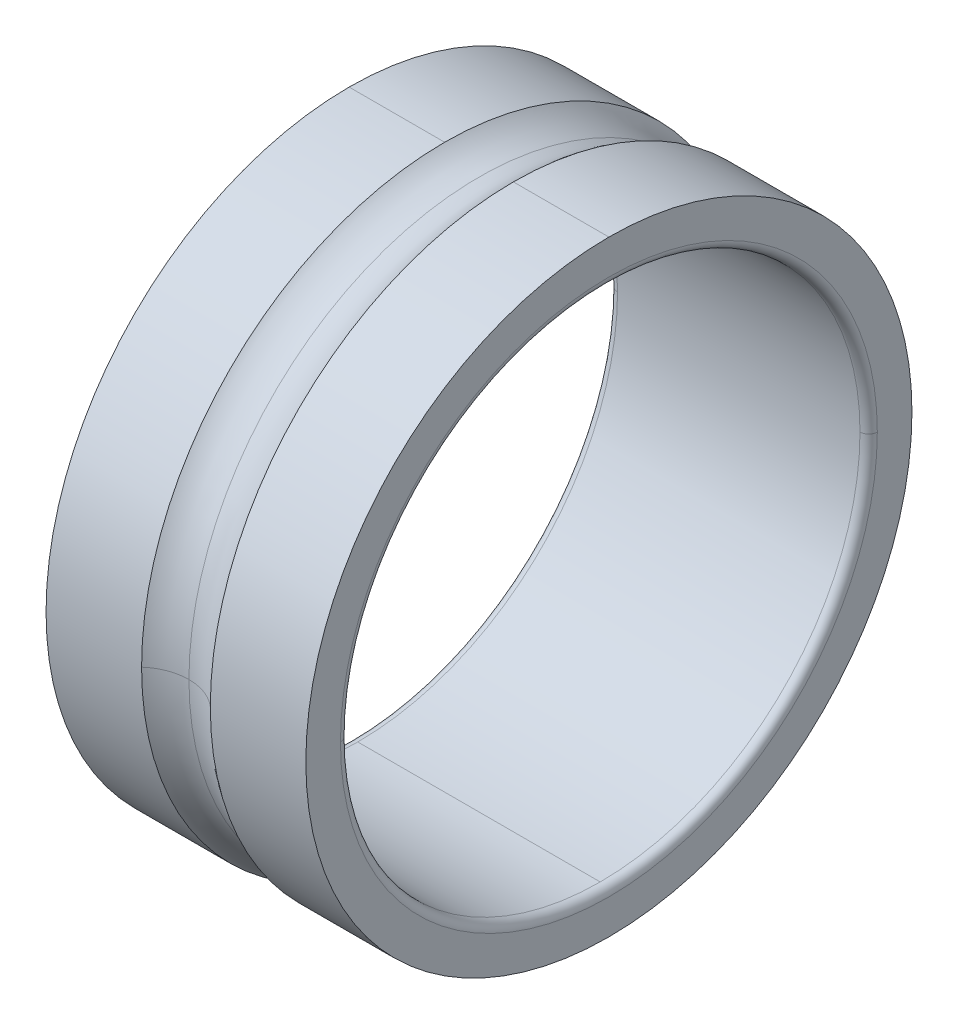
ISO-10303-21;
HEADER;
FILE_DESCRIPTION(('STEP AP214'),'2;1');
FILE_NAME('part.step','',(''),(''),'','','');
FILE_SCHEMA(('AUTOMOTIVE_DESIGN { 1 0 10303 214 1 1 1 1 }'));
ENDSEC;
DATA;
#1=APPLICATION_CONTEXT('core data for automotive mechanical design processes');
#2=APPLICATION_PROTOCOL_DEFINITION('international standard','automotive_design',2000,#1);
#3=PRODUCT_CONTEXT('',#1,'mechanical');
#4=PRODUCT('Part','Part','',(#3));
#5=PRODUCT_RELATED_PRODUCT_CATEGORY('part','',(#4));
#6=PRODUCT_DEFINITION_FORMATION('','',#4);
#7=PRODUCT_DEFINITION_CONTEXT('part definition',#1,'design');
#8=PRODUCT_DEFINITION('design','',#6,#7);
#9=PRODUCT_DEFINITION_SHAPE('','',#8);
#10=(LENGTH_UNIT() NAMED_UNIT(*) SI_UNIT(.MILLI.,.METRE.));
#11=(NAMED_UNIT(*) PLANE_ANGLE_UNIT() SI_UNIT($,.RADIAN.));
#12=(NAMED_UNIT(*) SI_UNIT($,.STERADIAN.) SOLID_ANGLE_UNIT());
#13=UNCERTAINTY_MEASURE_WITH_UNIT(LENGTH_MEASURE(1.E-05),#10,'distance_accuracy_value','');
#14=(GEOMETRIC_REPRESENTATION_CONTEXT(3) GLOBAL_UNCERTAINTY_ASSIGNED_CONTEXT((#13)) GLOBAL_UNIT_ASSIGNED_CONTEXT((#10,
#11,#12)) REPRESENTATION_CONTEXT('',''));
#15=CARTESIAN_POINT('',(0.,0.,0.));
#16=DIRECTION('',(0.,0.,1.));
#17=DIRECTION('',(1.,0.,0.));
#18=AXIS2_PLACEMENT_3D('',#15,#16,#17);
#19=CARTESIAN_POINT('',(2.44843134832985,0.,0.));
#20=DIRECTION('',(1.,0.,0.));
#21=DIRECTION('',(0.,1.,0.));
#22=AXIS2_PLACEMENT_3D('',#19,#20,#21);
#23=CYLINDRICAL_SURFACE('',#22,3.5);
#24=DIRECTION('',(1.,0.,0.));
#25=VECTOR('',#24,1.);
#26=CARTESIAN_POINT('',(2.44843134832985,3.5,0.));
#27=LINE('',#26,#25);
#28=CARTESIAN_POINT('',(1.89686269665969,3.5,0.));
#29=VERTEX_POINT('',#28);
#30=CARTESIAN_POINT('',(3.,3.5,0.));
#31=VERTEX_POINT('',#30);
#32=EDGE_CURVE('E153',#29,#31,#27,.T.);
#33=ORIENTED_EDGE('',*,*,#32,.T.);
#34=CARTESIAN_POINT('',(3.,0.,0.));
#35=DIRECTION('',(1.,0.,0.));
#36=DIRECTION('',(0.,1.,0.));
#37=AXIS2_PLACEMENT_3D('',#34,#35,#36);
#38=CIRCLE('',#37,3.5);
#39=CARTESIAN_POINT('',(3.,-3.5,0.));
#40=VERTEX_POINT('',#39);
#41=EDGE_CURVE('E175',#40,#31,#38,.T.);
#42=ORIENTED_EDGE('',*,*,#41,.F.);
#43=DIRECTION('',(-1.,0.,0.));
#44=VECTOR('',#43,1.);
#45=CARTESIAN_POINT('',(2.44843134832985,-3.5,0.));
#46=LINE('',#45,#44);
#47=CARTESIAN_POINT('',(1.89686269665969,-3.5,0.));
#48=VERTEX_POINT('',#47);
#49=EDGE_CURVE('E159',#40,#48,#46,.T.);
#50=ORIENTED_EDGE('',*,*,#49,.T.);
#51=CARTESIAN_POINT('',(1.89686269665969,0.,0.));
#52=DIRECTION('',(1.,0.,0.));
#53=DIRECTION('',(0.,1.,0.));
#54=AXIS2_PLACEMENT_3D('',#51,#52,#53);
#55=CIRCLE('',#54,3.5);
#56=CARTESIAN_POINT('',(1.89686269665969,0.,-3.5));
#57=VERTEX_POINT('',#56);
#58=EDGE_CURVE('E144',#48,#57,#55,.T.);
#59=ORIENTED_EDGE('',*,*,#58,.T.);
#60=CARTESIAN_POINT('',(1.89686269665969,0.,0.));
#61=DIRECTION('',(1.,0.,0.));
#62=DIRECTION('',(0.,1.,0.));
#63=AXIS2_PLACEMENT_3D('',#60,#61,#62);
#64=CIRCLE('',#63,3.5);
#65=EDGE_CURVE('E150',#57,#29,#64,.T.);
#66=ORIENTED_EDGE('',*,*,#65,.T.);
#67=EDGE_LOOP('',(#33,#42,#50,#59,#66));
#68=FACE_BOUND('',#67,.T.);
#69=ADVANCED_FACE('F16',(#68),#23,.T.);
#70=CARTESIAN_POINT('',(1.5,0.,0.));
#71=DIRECTION('',(1.,0.,0.));
#72=DIRECTION('',(0.,0.,-1.));
#73=AXIS2_PLACEMENT_3D('',#70,#71,#72);
#74=TOROIDAL_SURFACE('',#73,3.95,0.6);
#75=CARTESIAN_POINT('',(1.5,0.,0.));
#76=DIRECTION('',(-1.,0.,0.));
#77=DIRECTION('',(0.,0.,1.));
#78=AXIS2_PLACEMENT_3D('',#75,#76,#77);
#79=CIRCLE('',#78,3.35);
#80=CARTESIAN_POINT('',(1.5,0.,3.35));
#81=VERTEX_POINT('',#80);
#82=CARTESIAN_POINT('',(1.5,0.,-3.35));
#83=VERTEX_POINT('',#82);
#84=EDGE_CURVE('E137',#81,#83,#79,.T.);
#85=ORIENTED_EDGE('',*,*,#84,.T.);
#86=CARTESIAN_POINT('',(1.5,0.,-3.95));
#87=DIRECTION('',(0.,-1.,0.));
#88=DIRECTION('',(0.,0.,-1.));
#89=AXIS2_PLACEMENT_3D('',#86,#87,#88);
#90=CIRCLE('',#89,0.6);
#91=CARTESIAN_POINT('',(1.10313730334031,0.,-3.5));
#92=VERTEX_POINT('',#91);
#93=EDGE_CURVE('E126',#83,#92,#90,.T.);
#94=ORIENTED_EDGE('',*,*,#93,.T.);
#95=CARTESIAN_POINT('',(1.10313730334031,0.,0.));
#96=DIRECTION('',(1.,0.,0.));
#97=DIRECTION('',(0.,1.,0.));
#98=AXIS2_PLACEMENT_3D('',#95,#96,#97);
#99=CIRCLE('',#98,3.5);
#100=CARTESIAN_POINT('',(1.10313730334031,3.5,0.));
#101=VERTEX_POINT('',#100);
#102=EDGE_CURVE('E11',#92,#101,#99,.T.);
#103=ORIENTED_EDGE('',*,*,#102,.T.);
#104=CARTESIAN_POINT('',(1.10313730334031,0.,0.));
#105=DIRECTION('',(1.,0.,0.));
#106=DIRECTION('',(0.,1.,0.));
#107=AXIS2_PLACEMENT_3D('',#104,#105,#106);
#108=CIRCLE('',#107,3.5);
#109=CARTESIAN_POINT('',(1.10313730334031,0.,3.5));
#110=VERTEX_POINT('',#109);
#111=EDGE_CURVE('E125',#101,#110,#108,.T.);
#112=ORIENTED_EDGE('',*,*,#111,.T.);
#113=CARTESIAN_POINT('',(1.5,0.,3.95));
#114=DIRECTION('',(0.,-1.,0.));
#115=DIRECTION('',(0.,0.,1.));
#116=AXIS2_PLACEMENT_3D('',#113,#114,#115);
#117=CIRCLE('',#116,0.6);
#118=EDGE_CURVE('E168',#110,#81,#117,.T.);
#119=ORIENTED_EDGE('',*,*,#118,.T.);
#120=EDGE_LOOP('',(#85,#94,#103,#112,#119));
#121=FACE_BOUND('',#120,.T.);
#122=ADVANCED_FACE('F259',(#121),#74,.F.);
#123=CARTESIAN_POINT('',(0.551568651670155,0.,0.));
#124=DIRECTION('',(1.,0.,0.));
#125=DIRECTION('',(0.,1.,0.));
#126=AXIS2_PLACEMENT_3D('',#123,#124,#125);
#127=CYLINDRICAL_SURFACE('',#126,3.5);
#128=DIRECTION('',(1.,0.,0.));
#129=VECTOR('',#128,1.);
#130=CARTESIAN_POINT('',(0.551568651670155,3.5,0.));
#131=LINE('',#130,#129);
#132=CARTESIAN_POINT('',(0.,3.5,0.));
#133=VERTEX_POINT('',#132);
#134=EDGE_CURVE('E112',#133,#101,#131,.T.);
#135=ORIENTED_EDGE('',*,*,#134,.T.);
#136=ORIENTED_EDGE('',*,*,#102,.F.);
#137=CARTESIAN_POINT('',(1.10313730334031,0.,0.));
#138=DIRECTION('',(1.,0.,0.));
#139=DIRECTION('',(0.,1.,0.));
#140=AXIS2_PLACEMENT_3D('',#137,#138,#139);
#141=CIRCLE('',#140,3.5);
#142=CARTESIAN_POINT('',(1.10313730334031,-3.5,0.));
#143=VERTEX_POINT('',#142);
#144=EDGE_CURVE('E129',#143,#92,#141,.T.);
#145=ORIENTED_EDGE('',*,*,#144,.F.);
#146=DIRECTION('',(-1.,0.,0.));
#147=VECTOR('',#146,1.);
#148=CARTESIAN_POINT('',(0.551568651670155,-3.5,0.));
#149=LINE('',#148,#147);
#150=CARTESIAN_POINT('',(0.,-3.5,0.));
#151=VERTEX_POINT('',#150);
#152=EDGE_CURVE('E114',#143,#151,#149,.T.);
#153=ORIENTED_EDGE('',*,*,#152,.T.);
#154=CARTESIAN_POINT('',(0.,0.,0.));
#155=DIRECTION('',(1.,0.,0.));
#156=DIRECTION('',(0.,1.,0.));
#157=AXIS2_PLACEMENT_3D('',#154,#155,#156);
#158=CIRCLE('',#157,3.5);
#159=EDGE_CURVE('E23',#151,#133,#158,.T.);
#160=ORIENTED_EDGE('',*,*,#159,.T.);
#161=EDGE_LOOP('',(#135,#136,#145,#153,#160));
#162=FACE_BOUND('',#161,.T.);
#163=ADVANCED_FACE('F110',(#162),#127,.T.);
#164=CARTESIAN_POINT('',(0.,3.3,0.));
#165=DIRECTION('',(-1.,0.,0.));
#166=DIRECTION('',(0.,0.,1.));
#167=AXIS2_PLACEMENT_3D('',#164,#165,#166);
#168=PLANE('',#167);
#169=CARTESIAN_POINT('',(0.,0.,0.));
#170=DIRECTION('',(1.,0.,0.));
#171=DIRECTION('',(0.,1.,0.));
#172=AXIS2_PLACEMENT_3D('',#169,#170,#171);
#173=CIRCLE('',#172,3.1);
#174=CARTESIAN_POINT('',(0.,0.,3.1));
#175=VERTEX_POINT('',#174);
#176=CARTESIAN_POINT('',(0.,0.,-3.1));
#177=VERTEX_POINT('',#176);
#178=EDGE_CURVE('E117',#175,#177,#173,.T.);
#179=ORIENTED_EDGE('',*,*,#178,.T.);
#180=CARTESIAN_POINT('',(0.,0.,0.));
#181=DIRECTION('',(1.,0.,0.));
#182=DIRECTION('',(0.,1.,0.));
#183=AXIS2_PLACEMENT_3D('',#180,#181,#182);
#184=CIRCLE('',#183,3.1);
#185=EDGE_CURVE('E193',#177,#175,#184,.T.);
#186=ORIENTED_EDGE('',*,*,#185,.T.);
#187=EDGE_LOOP('',(#179,#186));
#188=FACE_BOUND('',#187,.T.);
#189=CARTESIAN_POINT('',(0.,0.,0.));
#190=DIRECTION('',(1.,0.,0.));
#191=DIRECTION('',(0.,1.,0.));
#192=AXIS2_PLACEMENT_3D('',#189,#190,#191);
#193=CIRCLE('',#192,3.5);
#194=EDGE_CURVE('E118',#133,#151,#193,.T.);
#195=ORIENTED_EDGE('',*,*,#194,.F.);
#196=ORIENTED_EDGE('',*,*,#159,.F.);
#197=EDGE_LOOP('',(#195,#196));
#198=FACE_BOUND('',#197,.T.);
#199=ADVANCED_FACE('F119',(#188,#198),#168,.T.);
#200=CARTESIAN_POINT('',(0.1,0.,0.));
#201=DIRECTION('',(1.,0.,0.));
#202=DIRECTION('',(0.,0.,-1.));
#203=AXIS2_PLACEMENT_3D('',#200,#201,#202);
#204=TOROIDAL_SURFACE('',#203,3.1,0.1);
#205=CARTESIAN_POINT('',(0.1,0.,-3.1));
#206=DIRECTION('',(0.,-1.,0.));
#207=DIRECTION('',(0.,0.,-1.));
#208=AXIS2_PLACEMENT_3D('',#205,#206,#207);
#209=CIRCLE('',#208,0.1);
#210=CARTESIAN_POINT('',(0.1,0.,-3.));
#211=VERTEX_POINT('',#210);
#212=EDGE_CURVE('E181',#211,#177,#209,.T.);
#213=ORIENTED_EDGE('',*,*,#212,.T.);
#214=ORIENTED_EDGE('',*,*,#178,.F.);
#215=CARTESIAN_POINT('',(0.1,0.,3.1));
#216=DIRECTION('',(0.,-1.,0.));
#217=DIRECTION('',(0.,0.,1.));
#218=AXIS2_PLACEMENT_3D('',#215,#216,#217);
#219=CIRCLE('',#218,0.1);
#220=CARTESIAN_POINT('',(0.1,0.,3.));
#221=VERTEX_POINT('',#220);
#222=EDGE_CURVE('E190',#175,#221,#219,.T.);
#223=ORIENTED_EDGE('',*,*,#222,.T.);
#224=CARTESIAN_POINT('',(0.1,0.,0.));
#225=DIRECTION('',(1.,0.,0.));
#226=DIRECTION('',(0.,1.,0.));
#227=AXIS2_PLACEMENT_3D('',#224,#225,#226);
#228=CIRCLE('',#227,3.);
#229=CARTESIAN_POINT('',(0.1,-3.,0.));
#230=VERTEX_POINT('',#229);
#231=EDGE_CURVE('E214',#221,#230,#228,.T.);
#232=ORIENTED_EDGE('',*,*,#231,.T.);
#233=CARTESIAN_POINT('',(0.1,0.,0.));
#234=DIRECTION('',(1.,0.,0.));
#235=DIRECTION('',(0.,1.,0.));
#236=AXIS2_PLACEMENT_3D('',#233,#234,#235);
#237=CIRCLE('',#236,3.);
#238=EDGE_CURVE('E136',#230,#211,#237,.T.);
#239=ORIENTED_EDGE('',*,*,#238,.T.);
#240=EDGE_LOOP('',(#213,#214,#223,#232,#239));
#241=FACE_BOUND('',#240,.T.);
#242=ADVANCED_FACE('F223',(#241),#204,.T.);
#243=CARTESIAN_POINT('',(1.5,0.,0.));
#244=DIRECTION('',(1.,0.,0.));
#245=DIRECTION('',(0.,1.,0.));
#246=AXIS2_PLACEMENT_3D('',#243,#244,#245);
#247=CYLINDRICAL_SURFACE('',#246,3.);
#248=DIRECTION('',(1.,0.,0.));
#249=VECTOR('',#248,1.);
#250=CARTESIAN_POINT('',(1.5,3.,0.));
#251=LINE('',#250,#249);
#252=CARTESIAN_POINT('',(0.1,3.,0.));
#253=VERTEX_POINT('',#252);
#254=CARTESIAN_POINT('',(2.9,3.,0.));
#255=VERTEX_POINT('',#254);
#256=EDGE_CURVE('E196',#253,#255,#251,.T.);
#257=ORIENTED_EDGE('',*,*,#256,.T.);
#258=CARTESIAN_POINT('',(2.9,0.,0.));
#259=DIRECTION('',(1.,0.,0.));
#260=DIRECTION('',(0.,1.,0.));
#261=AXIS2_PLACEMENT_3D('',#258,#259,#260);
#262=CIRCLE('',#261,3.);
#263=CARTESIAN_POINT('',(2.9,0.,3.));
#264=VERTEX_POINT('',#263);
#265=EDGE_CURVE('E173',#255,#264,#262,.T.);
#266=ORIENTED_EDGE('',*,*,#265,.T.);
#267=CARTESIAN_POINT('',(2.9,0.,0.));
#268=DIRECTION('',(1.,0.,0.));
#269=DIRECTION('',(0.,1.,0.));
#270=AXIS2_PLACEMENT_3D('',#267,#268,#269);
#271=CIRCLE('',#270,3.);
#272=CARTESIAN_POINT('',(2.9,-3.,0.));
#273=VERTEX_POINT('',#272);
#274=EDGE_CURVE('E30',#264,#273,#271,.T.);
#275=ORIENTED_EDGE('',*,*,#274,.T.);
#276=DIRECTION('',(-1.,0.,0.));
#277=VECTOR('',#276,1.);
#278=CARTESIAN_POINT('',(1.5,-3.,0.));
#279=LINE('',#278,#277);
#280=EDGE_CURVE('E132',#273,#230,#279,.T.);
#281=ORIENTED_EDGE('',*,*,#280,.T.);
#282=ORIENTED_EDGE('',*,*,#231,.F.);
#283=CARTESIAN_POINT('',(0.1,0.,0.));
#284=DIRECTION('',(1.,0.,0.));
#285=DIRECTION('',(0.,1.,0.));
#286=AXIS2_PLACEMENT_3D('',#283,#284,#285);
#287=CIRCLE('',#286,3.);
#288=EDGE_CURVE('E187',#253,#221,#287,.T.);
#289=ORIENTED_EDGE('',*,*,#288,.F.);
#290=EDGE_LOOP('',(#257,#266,#275,#281,#282,#289));
#291=FACE_BOUND('',#290,.T.);
#292=ADVANCED_FACE('F231',(#291),#247,.F.);
#293=CARTESIAN_POINT('',(2.9,0.,0.));
#294=DIRECTION('',(1.,0.,0.));
#295=DIRECTION('',(0.,0.,-1.));
#296=AXIS2_PLACEMENT_3D('',#293,#294,#295);
#297=TOROIDAL_SURFACE('',#296,3.1,0.1);
#298=CARTESIAN_POINT('',(2.9,0.,-3.1));
#299=DIRECTION('',(0.,-1.,0.));
#300=DIRECTION('',(0.,0.,-1.));
#301=AXIS2_PLACEMENT_3D('',#298,#299,#300);
#302=CIRCLE('',#301,0.1);
#303=CARTESIAN_POINT('',(3.,0.,-3.1));
#304=VERTEX_POINT('',#303);
#305=CARTESIAN_POINT('',(2.9,0.,-3.));
#306=VERTEX_POINT('',#305);
#307=EDGE_CURVE('E205',#304,#306,#302,.T.);
#308=ORIENTED_EDGE('',*,*,#307,.T.);
#309=CARTESIAN_POINT('',(2.9,0.,0.));
#310=DIRECTION('',(1.,0.,0.));
#311=DIRECTION('',(0.,1.,0.));
#312=AXIS2_PLACEMENT_3D('',#309,#310,#311);
#313=CIRCLE('',#312,3.);
#314=EDGE_CURVE('E135',#273,#306,#313,.T.);
#315=ORIENTED_EDGE('',*,*,#314,.F.);
#316=ORIENTED_EDGE('',*,*,#274,.F.);
#317=CARTESIAN_POINT('',(2.9,0.,3.1));
#318=DIRECTION('',(0.,-1.,0.));
#319=DIRECTION('',(0.,0.,1.));
#320=AXIS2_PLACEMENT_3D('',#317,#318,#319);
#321=CIRCLE('',#320,0.1);
#322=CARTESIAN_POINT('',(3.,0.,3.1));
#323=VERTEX_POINT('',#322);
#324=EDGE_CURVE('E176',#264,#323,#321,.T.);
#325=ORIENTED_EDGE('',*,*,#324,.T.);
#326=CARTESIAN_POINT('',(3.,0.,0.));
#327=DIRECTION('',(1.,0.,0.));
#328=DIRECTION('',(0.,1.,0.));
#329=AXIS2_PLACEMENT_3D('',#326,#327,#328);
#330=CIRCLE('',#329,3.1);
#331=EDGE_CURVE('E37',#323,#304,#330,.T.);
#332=ORIENTED_EDGE('',*,*,#331,.T.);
#333=EDGE_LOOP('',(#308,#315,#316,#325,#332));
#334=FACE_BOUND('',#333,.T.);
#335=ADVANCED_FACE('F233',(#334),#297,.T.);
#336=CARTESIAN_POINT('',(3.,3.3,0.));
#337=DIRECTION('',(1.,0.,0.));
#338=DIRECTION('',(0.,1.,0.));
#339=AXIS2_PLACEMENT_3D('',#336,#337,#338);
#340=PLANE('',#339);
#341=CARTESIAN_POINT('',(3.,0.,0.));
#342=DIRECTION('',(1.,0.,0.));
#343=DIRECTION('',(0.,1.,0.));
#344=AXIS2_PLACEMENT_3D('',#341,#342,#343);
#345=CIRCLE('',#344,3.1);
#346=EDGE_CURVE('E207',#304,#323,#345,.T.);
#347=ORIENTED_EDGE('',*,*,#346,.F.);
#348=ORIENTED_EDGE('',*,*,#331,.F.);
#349=EDGE_LOOP('',(#347,#348));
#350=FACE_BOUND('',#349,.T.);
#351=CARTESIAN_POINT('',(3.,0.,0.));
#352=DIRECTION('',(1.,0.,0.));
#353=DIRECTION('',(0.,1.,0.));
#354=AXIS2_PLACEMENT_3D('',#351,#352,#353);
#355=CIRCLE('',#354,3.5);
#356=EDGE_CURVE('E161',#31,#40,#355,.T.);
#357=ORIENTED_EDGE('',*,*,#356,.T.);
#358=ORIENTED_EDGE('',*,*,#41,.T.);
#359=EDGE_LOOP('',(#357,#358));
#360=FACE_BOUND('',#359,.T.);
#361=ADVANCED_FACE('F238',(#350,#360),#340,.T.);
#362=CARTESIAN_POINT('',(2.9,0.,0.));
#363=DIRECTION('',(1.,0.,0.));
#364=DIRECTION('',(0.,0.,-1.));
#365=AXIS2_PLACEMENT_3D('',#362,#363,#364);
#366=TOROIDAL_SURFACE('',#365,3.1,0.1);
#367=ORIENTED_EDGE('',*,*,#307,.F.);
#368=ORIENTED_EDGE('',*,*,#346,.T.);
#369=ORIENTED_EDGE('',*,*,#324,.F.);
#370=ORIENTED_EDGE('',*,*,#265,.F.);
#371=CARTESIAN_POINT('',(2.9,0.,0.));
#372=DIRECTION('',(1.,0.,0.));
#373=DIRECTION('',(0.,1.,0.));
#374=AXIS2_PLACEMENT_3D('',#371,#372,#373);
#375=CIRCLE('',#374,3.);
#376=EDGE_CURVE('E202',#306,#255,#375,.T.);
#377=ORIENTED_EDGE('',*,*,#376,.F.);
#378=EDGE_LOOP('',(#367,#368,#369,#370,#377));
#379=FACE_BOUND('',#378,.T.);
#380=ADVANCED_FACE('F236',(#379),#366,.T.);
#381=CARTESIAN_POINT('',(1.5,0.,0.));
#382=DIRECTION('',(1.,0.,0.));
#383=DIRECTION('',(0.,1.,0.));
#384=AXIS2_PLACEMENT_3D('',#381,#382,#383);
#385=CYLINDRICAL_SURFACE('',#384,3.);
#386=ORIENTED_EDGE('',*,*,#256,.F.);
#387=CARTESIAN_POINT('',(0.1,0.,0.));
#388=DIRECTION('',(1.,0.,0.));
#389=DIRECTION('',(0.,1.,0.));
#390=AXIS2_PLACEMENT_3D('',#387,#388,#389);
#391=CIRCLE('',#390,3.);
#392=EDGE_CURVE('E184',#211,#253,#391,.T.);
#393=ORIENTED_EDGE('',*,*,#392,.F.);
#394=ORIENTED_EDGE('',*,*,#238,.F.);
#395=ORIENTED_EDGE('',*,*,#280,.F.);
#396=ORIENTED_EDGE('',*,*,#314,.T.);
#397=ORIENTED_EDGE('',*,*,#376,.T.);
#398=EDGE_LOOP('',(#386,#393,#394,#395,#396,#397));
#399=FACE_BOUND('',#398,.T.);
#400=ADVANCED_FACE('F228',(#399),#385,.F.);
#401=CARTESIAN_POINT('',(0.1,0.,0.));
#402=DIRECTION('',(1.,0.,0.));
#403=DIRECTION('',(0.,0.,-1.));
#404=AXIS2_PLACEMENT_3D('',#401,#402,#403);
#405=TOROIDAL_SURFACE('',#404,3.1,0.1);
#406=ORIENTED_EDGE('',*,*,#212,.F.);
#407=ORIENTED_EDGE('',*,*,#392,.T.);
#408=ORIENTED_EDGE('',*,*,#288,.T.);
#409=ORIENTED_EDGE('',*,*,#222,.F.);
#410=ORIENTED_EDGE('',*,*,#185,.F.);
#411=EDGE_LOOP('',(#406,#407,#408,#409,#410));
#412=FACE_BOUND('',#411,.T.);
#413=ADVANCED_FACE('F222',(#412),#405,.T.);
#414=CARTESIAN_POINT('',(0.551568651670155,0.,0.));
#415=DIRECTION('',(1.,0.,0.));
#416=DIRECTION('',(0.,1.,0.));
#417=AXIS2_PLACEMENT_3D('',#414,#415,#416);
#418=CYLINDRICAL_SURFACE('',#417,3.5);
#419=ORIENTED_EDGE('',*,*,#134,.F.);
#420=ORIENTED_EDGE('',*,*,#194,.T.);
#421=ORIENTED_EDGE('',*,*,#152,.F.);
#422=CARTESIAN_POINT('',(1.10313730334031,0.,0.));
#423=DIRECTION('',(1.,0.,0.));
#424=DIRECTION('',(0.,1.,0.));
#425=AXIS2_PLACEMENT_3D('',#422,#423,#424);
#426=CIRCLE('',#425,3.5);
#427=EDGE_CURVE('E170',#110,#143,#426,.T.);
#428=ORIENTED_EDGE('',*,*,#427,.F.);
#429=ORIENTED_EDGE('',*,*,#111,.F.);
#430=EDGE_LOOP('',(#419,#420,#421,#428,#429));
#431=FACE_BOUND('',#430,.T.);
#432=ADVANCED_FACE('F123',(#431),#418,.T.);
#433=CARTESIAN_POINT('',(1.5,0.,0.));
#434=DIRECTION('',(1.,0.,0.));
#435=DIRECTION('',(0.,0.,-1.));
#436=AXIS2_PLACEMENT_3D('',#433,#434,#435);
#437=TOROIDAL_SURFACE('',#436,3.95,0.6);
#438=CARTESIAN_POINT('',(1.5,0.,0.));
#439=DIRECTION('',(-1.,0.,0.));
#440=DIRECTION('',(0.,0.,1.));
#441=AXIS2_PLACEMENT_3D('',#438,#439,#440);
#442=CIRCLE('',#441,3.35);
#443=EDGE_CURVE('E147',#83,#81,#442,.T.);
#444=ORIENTED_EDGE('',*,*,#443,.T.);
#445=ORIENTED_EDGE('',*,*,#118,.F.);
#446=ORIENTED_EDGE('',*,*,#427,.T.);
#447=ORIENTED_EDGE('',*,*,#144,.T.);
#448=ORIENTED_EDGE('',*,*,#93,.F.);
#449=EDGE_LOOP('',(#444,#445,#446,#447,#448));
#450=FACE_BOUND('',#449,.T.);
#451=ADVANCED_FACE('F262',(#450),#437,.F.);
#452=CARTESIAN_POINT('',(2.44843134832985,0.,0.));
#453=DIRECTION('',(1.,0.,0.));
#454=DIRECTION('',(0.,1.,0.));
#455=AXIS2_PLACEMENT_3D('',#452,#453,#454);
#456=CYLINDRICAL_SURFACE('',#455,3.5);
#457=ORIENTED_EDGE('',*,*,#32,.F.);
#458=CARTESIAN_POINT('',(1.89686269665969,0.,0.));
#459=DIRECTION('',(1.,0.,0.));
#460=DIRECTION('',(0.,1.,0.));
#461=AXIS2_PLACEMENT_3D('',#458,#459,#460);
#462=CIRCLE('',#461,3.5);
#463=CARTESIAN_POINT('',(1.89686269665969,0.,3.5));
#464=VERTEX_POINT('',#463);
#465=EDGE_CURVE('E143',#29,#464,#462,.T.);
#466=ORIENTED_EDGE('',*,*,#465,.T.);
#467=CARTESIAN_POINT('',(1.89686269665969,0.,0.));
#468=DIRECTION('',(1.,0.,0.));
#469=DIRECTION('',(0.,1.,0.));
#470=AXIS2_PLACEMENT_3D('',#467,#468,#469);
#471=CIRCLE('',#470,3.5);
#472=EDGE_CURVE('E146',#464,#48,#471,.T.);
#473=ORIENTED_EDGE('',*,*,#472,.T.);
#474=ORIENTED_EDGE('',*,*,#49,.F.);
#475=ORIENTED_EDGE('',*,*,#356,.F.);
#476=EDGE_LOOP('',(#457,#466,#473,#474,#475));
#477=FACE_BOUND('',#476,.T.);
#478=ADVANCED_FACE('F245',(#477),#456,.T.);
#479=CARTESIAN_POINT('',(1.5,0.,0.));
#480=DIRECTION('',(1.,0.,0.));
#481=DIRECTION('',(0.,0.,-1.));
#482=AXIS2_PLACEMENT_3D('',#479,#480,#481);
#483=TOROIDAL_SURFACE('',#482,3.95,0.6);
#484=ORIENTED_EDGE('',*,*,#443,.F.);
#485=CARTESIAN_POINT('',(1.5,0.,-3.95));
#486=DIRECTION('',(0.,-1.,0.));
#487=DIRECTION('',(0.,0.,-1.));
#488=AXIS2_PLACEMENT_3D('',#485,#486,#487);
#489=CIRCLE('',#488,0.6);
#490=EDGE_CURVE('E156',#57,#83,#489,.T.);
#491=ORIENTED_EDGE('',*,*,#490,.F.);
#492=ORIENTED_EDGE('',*,*,#58,.F.);
#493=ORIENTED_EDGE('',*,*,#472,.F.);
#494=CARTESIAN_POINT('',(1.5,0.,3.95));
#495=DIRECTION('',(0.,-1.,0.));
#496=DIRECTION('',(0.,0.,1.));
#497=AXIS2_PLACEMENT_3D('',#494,#495,#496);
#498=CIRCLE('',#497,0.6);
#499=EDGE_CURVE('E140',#81,#464,#498,.T.);
#500=ORIENTED_EDGE('',*,*,#499,.F.);
#501=EDGE_LOOP('',(#484,#491,#492,#493,#500));
#502=FACE_BOUND('',#501,.T.);
#503=ADVANCED_FACE('F257',(#502),#483,.F.);
#504=CARTESIAN_POINT('',(1.5,0.,0.));
#505=DIRECTION('',(1.,0.,0.));
#506=DIRECTION('',(0.,0.,-1.));
#507=AXIS2_PLACEMENT_3D('',#504,#505,#506);
#508=TOROIDAL_SURFACE('',#507,3.95,0.6);
#509=ORIENTED_EDGE('',*,*,#84,.F.);
#510=ORIENTED_EDGE('',*,*,#499,.T.);
#511=ORIENTED_EDGE('',*,*,#465,.F.);
#512=ORIENTED_EDGE('',*,*,#65,.F.);
#513=ORIENTED_EDGE('',*,*,#490,.T.);
#514=EDGE_LOOP('',(#509,#510,#511,#512,#513));
#515=FACE_BOUND('',#514,.T.);
#516=ADVANCED_FACE('F254',(#515),#508,.F.);
#517=CLOSED_SHELL('',(#69,#122,#163,#199,#242,#292,#335,#361,#380,#400,#413,#432,#451,#478,#503,#516));
#518=MANIFOLD_SOLID_BREP('B1',#517);
#519=ADVANCED_BREP_SHAPE_REPRESENTATION('',(#18,#518),#14);
#520=SHAPE_DEFINITION_REPRESENTATION(#9,#519);
ENDSEC;
END-ISO-10303-21;
